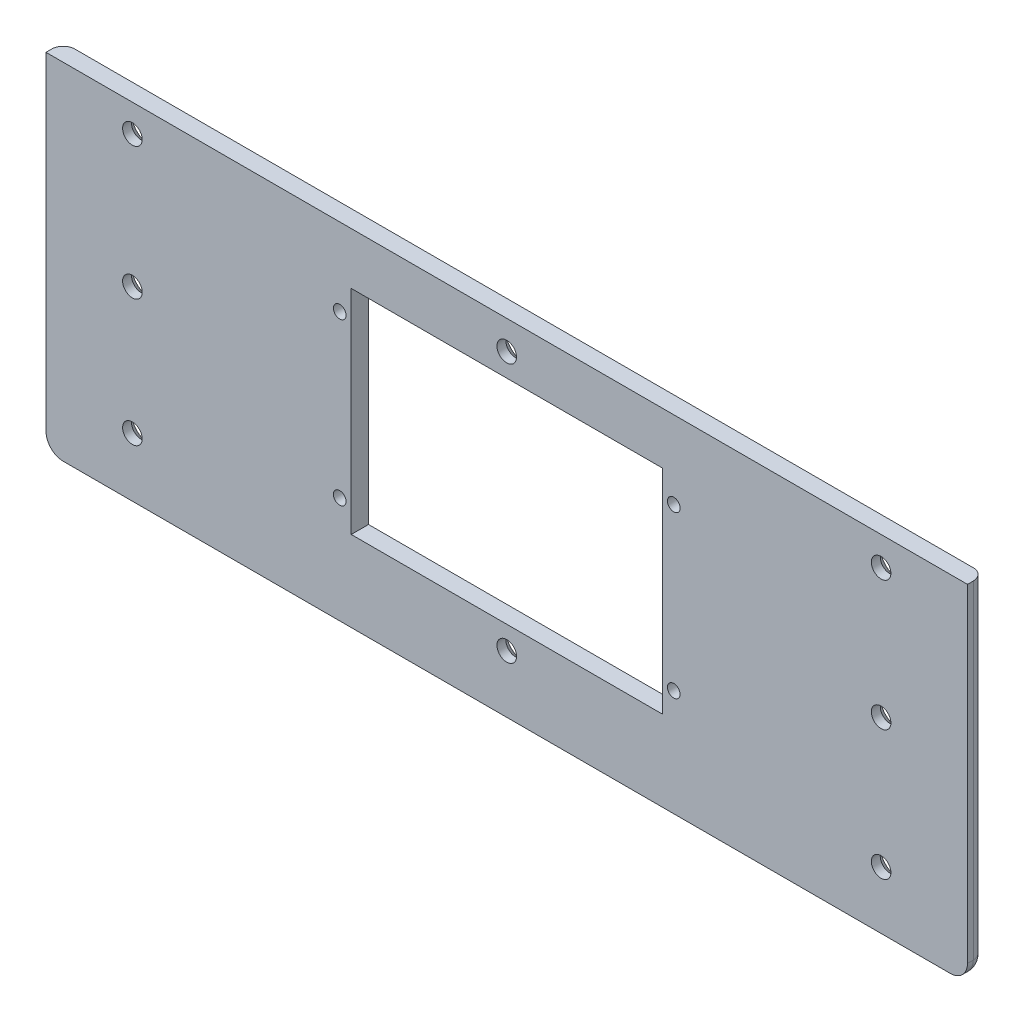
ISO-10303-21;
HEADER;
FILE_DESCRIPTION(('STEP AP214'),'2;1');
FILE_NAME('part.step','',(''),(''),'','','');
FILE_SCHEMA(('AUTOMOTIVE_DESIGN { 1 0 10303 214 1 1 1 1 }'));
ENDSEC;
DATA;
#1=APPLICATION_CONTEXT('core data for automotive mechanical design processes');
#2=APPLICATION_PROTOCOL_DEFINITION('international standard','automotive_design',2000,#1);
#3=PRODUCT_CONTEXT('',#1,'mechanical');
#4=PRODUCT('Part','Part','',(#3));
#5=PRODUCT_RELATED_PRODUCT_CATEGORY('part','',(#4));
#6=PRODUCT_DEFINITION_FORMATION('','',#4);
#7=PRODUCT_DEFINITION_CONTEXT('part definition',#1,'design');
#8=PRODUCT_DEFINITION('design','',#6,#7);
#9=PRODUCT_DEFINITION_SHAPE('','',#8);
#10=(LENGTH_UNIT() NAMED_UNIT(*) SI_UNIT(.MILLI.,.METRE.));
#11=(NAMED_UNIT(*) PLANE_ANGLE_UNIT() SI_UNIT($,.RADIAN.));
#12=(NAMED_UNIT(*) SI_UNIT($,.STERADIAN.) SOLID_ANGLE_UNIT());
#13=UNCERTAINTY_MEASURE_WITH_UNIT(LENGTH_MEASURE(1.E-05),#10,'distance_accuracy_value','');
#14=(GEOMETRIC_REPRESENTATION_CONTEXT(3) GLOBAL_UNCERTAINTY_ASSIGNED_CONTEXT((#13)) GLOBAL_UNIT_ASSIGNED_CONTEXT((#10,
#11,#12)) REPRESENTATION_CONTEXT('',''));
#15=CARTESIAN_POINT('',(0.,0.,0.));
#16=DIRECTION('',(0.,0.,1.));
#17=DIRECTION('',(1.,0.,0.));
#18=AXIS2_PLACEMENT_3D('',#15,#16,#17);
#19=CARTESIAN_POINT('',(0.,0.,0.));
#20=DIRECTION('',(0.,0.,-1.));
#21=DIRECTION('',(-1.,0.,0.));
#22=AXIS2_PLACEMENT_3D('',#19,#20,#21);
#23=PLANE('',#22);
#24=CARTESIAN_POINT('',(145.,54.9999999999999,0.));
#25=DIRECTION('',(0.,0.,-1.));
#26=DIRECTION('',(-1.,0.,0.));
#27=AXIS2_PLACEMENT_3D('',#24,#25,#26);
#28=CIRCLE('',#27,3.14999999999999);
#29=CARTESIAN_POINT('',(141.85,54.9999999999999,0.));
#30=VERTEX_POINT('',#29);
#31=EDGE_CURVE('E537',#30,#30,#28,.T.);
#32=ORIENTED_EDGE('',*,*,#31,.F.);
#33=EDGE_LOOP('',(#32));
#34=FACE_BOUND('',#33,.T.);
#35=CARTESIAN_POINT('',(145.,32.5,0.));
#36=DIRECTION('',(0.,0.,-1.));
#37=DIRECTION('',(-1.,0.,0.));
#38=AXIS2_PLACEMENT_3D('',#35,#36,#37);
#39=CIRCLE('',#38,3.15000000000001);
#40=CARTESIAN_POINT('',(141.85,32.5,0.));
#41=VERTEX_POINT('',#40);
#42=EDGE_CURVE('E547',#41,#41,#39,.T.);
#43=ORIENTED_EDGE('',*,*,#42,.F.);
#44=EDGE_LOOP('',(#43));
#45=FACE_BOUND('',#44,.T.);
#46=CARTESIAN_POINT('',(145.,9.99999999999992,0.));
#47=DIRECTION('',(0.,0.,-1.));
#48=DIRECTION('',(-1.,0.,0.));
#49=AXIS2_PLACEMENT_3D('',#46,#47,#48);
#50=CIRCLE('',#49,3.15000000000001);
#51=CARTESIAN_POINT('',(141.85,9.99999999999992,0.));
#52=VERTEX_POINT('',#51);
#53=EDGE_CURVE('E558',#52,#52,#50,.T.);
#54=ORIENTED_EDGE('',*,*,#53,.F.);
#55=EDGE_LOOP('',(#54));
#56=FACE_BOUND('',#55,.T.);
#57=CARTESIAN_POINT('',(80.,9.99999999999992,0.));
#58=DIRECTION('',(0.,0.,-1.));
#59=DIRECTION('',(-1.,0.,0.));
#60=AXIS2_PLACEMENT_3D('',#57,#58,#59);
#61=CIRCLE('',#60,3.15);
#62=CARTESIAN_POINT('',(76.85,9.99999999999992,0.));
#63=VERTEX_POINT('',#62);
#64=EDGE_CURVE('E570',#63,#63,#61,.T.);
#65=ORIENTED_EDGE('',*,*,#64,.F.);
#66=EDGE_LOOP('',(#65));
#67=FACE_BOUND('',#66,.T.);
#68=CARTESIAN_POINT('',(80.,54.9999999999999,0.));
#69=DIRECTION('',(0.,0.,-1.));
#70=DIRECTION('',(-1.,0.,0.));
#71=AXIS2_PLACEMENT_3D('',#68,#69,#70);
#72=CIRCLE('',#71,3.15);
#73=CARTESIAN_POINT('',(76.85,54.9999999999999,0.));
#74=VERTEX_POINT('',#73);
#75=EDGE_CURVE('E582',#74,#74,#72,.T.);
#76=ORIENTED_EDGE('',*,*,#75,.F.);
#77=EDGE_LOOP('',(#76));
#78=FACE_BOUND('',#77,.T.);
#79=CARTESIAN_POINT('',(14.9999999999998,55.2287243030791,0.));
#80=DIRECTION('',(0.,0.,-1.));
#81=DIRECTION('',(-1.,0.,0.));
#82=AXIS2_PLACEMENT_3D('',#79,#80,#81);
#83=CIRCLE('',#82,3.15);
#84=CARTESIAN_POINT('',(11.8499999999998,55.2287243030791,0.));
#85=VERTEX_POINT('',#84);
#86=EDGE_CURVE('E594',#85,#85,#83,.T.);
#87=ORIENTED_EDGE('',*,*,#86,.F.);
#88=EDGE_LOOP('',(#87));
#89=FACE_BOUND('',#88,.T.);
#90=CARTESIAN_POINT('',(14.9999999999998,32.2712756969208,0.));
#91=DIRECTION('',(0.,0.,-1.));
#92=DIRECTION('',(-1.,0.,0.));
#93=AXIS2_PLACEMENT_3D('',#90,#91,#92);
#94=CIRCLE('',#93,3.15);
#95=CARTESIAN_POINT('',(11.8499999999998,32.2712756969208,0.));
#96=VERTEX_POINT('',#95);
#97=EDGE_CURVE('E606',#96,#96,#94,.T.);
#98=ORIENTED_EDGE('',*,*,#97,.F.);
#99=EDGE_LOOP('',(#98));
#100=FACE_BOUND('',#99,.T.);
#101=CARTESIAN_POINT('',(14.9999999999998,10.2287243030791,0.));
#102=DIRECTION('',(0.,0.,-1.));
#103=DIRECTION('',(-1.,0.,0.));
#104=AXIS2_PLACEMENT_3D('',#101,#102,#103);
#105=CIRCLE('',#104,3.15);
#106=CARTESIAN_POINT('',(11.8499999999998,10.2287243030791,0.));
#107=VERTEX_POINT('',#106);
#108=EDGE_CURVE('E330',#107,#107,#105,.T.);
#109=ORIENTED_EDGE('',*,*,#108,.F.);
#110=EDGE_LOOP('',(#109));
#111=FACE_BOUND('',#110,.T.);
#112=CARTESIAN_POINT('',(50.9999999999999,46.4999999999999,0.));
#113=DIRECTION('',(0.,0.,-1.));
#114=DIRECTION('',(-1.,0.,0.));
#115=AXIS2_PLACEMENT_3D('',#112,#113,#114);
#116=CIRCLE('',#115,1.1);
#117=CARTESIAN_POINT('',(49.8999999999999,46.4999999999999,0.));
#118=VERTEX_POINT('',#117);
#119=EDGE_CURVE('E315',#118,#118,#116,.T.);
#120=ORIENTED_EDGE('',*,*,#119,.F.);
#121=EDGE_LOOP('',(#120));
#122=FACE_BOUND('',#121,.T.);
#123=CARTESIAN_POINT('',(50.9999999999999,18.5,0.));
#124=DIRECTION('',(0.,0.,-1.));
#125=DIRECTION('',(-1.,0.,0.));
#126=AXIS2_PLACEMENT_3D('',#123,#124,#125);
#127=CIRCLE('',#126,1.1);
#128=CARTESIAN_POINT('',(49.8999999999999,18.5,0.));
#129=VERTEX_POINT('',#128);
#130=EDGE_CURVE('E348',#129,#129,#127,.T.);
#131=ORIENTED_EDGE('',*,*,#130,.F.);
#132=EDGE_LOOP('',(#131));
#133=FACE_BOUND('',#132,.T.);
#134=CARTESIAN_POINT('',(109.,18.5,0.));
#135=DIRECTION('',(0.,0.,-1.));
#136=DIRECTION('',(-1.,0.,0.));
#137=AXIS2_PLACEMENT_3D('',#134,#135,#136);
#138=CIRCLE('',#137,1.10000000000001);
#139=CARTESIAN_POINT('',(107.9,18.5,0.));
#140=VERTEX_POINT('',#139);
#141=EDGE_CURVE('E341',#140,#140,#138,.T.);
#142=ORIENTED_EDGE('',*,*,#141,.F.);
#143=EDGE_LOOP('',(#142));
#144=FACE_BOUND('',#143,.T.);
#145=CARTESIAN_POINT('',(109.,46.5,0.));
#146=DIRECTION('',(0.,0.,-1.));
#147=DIRECTION('',(-1.,0.,0.));
#148=AXIS2_PLACEMENT_3D('',#145,#146,#147);
#149=CIRCLE('',#148,1.10000000000001);
#150=CARTESIAN_POINT('',(107.9,46.5,0.));
#151=VERTEX_POINT('',#150);
#152=EDGE_CURVE('E213',#151,#151,#149,.T.);
#153=ORIENTED_EDGE('',*,*,#152,.F.);
#154=EDGE_LOOP('',(#153));
#155=FACE_BOUND('',#154,.T.);
#156=DIRECTION('',(0.,-1.,0.));
#157=VECTOR('',#156,1.);
#158=CARTESIAN_POINT('',(107.,50.9999999999999,0.));
#159=LINE('',#158,#157);
#160=CARTESIAN_POINT('',(107.,50.9999999999999,0.));
#161=VERTEX_POINT('',#160);
#162=CARTESIAN_POINT('',(107.,14.,0.));
#163=VERTEX_POINT('',#162);
#164=EDGE_CURVE('E174',#161,#163,#159,.T.);
#165=ORIENTED_EDGE('',*,*,#164,.F.);
#166=DIRECTION('',(1.,0.,0.));
#167=VECTOR('',#166,1.);
#168=CARTESIAN_POINT('',(107.,50.9999999999999,0.));
#169=LINE('',#168,#167);
#170=CARTESIAN_POINT('',(52.9999999999999,50.9999999999999,0.));
#171=VERTEX_POINT('',#170);
#172=EDGE_CURVE('E194',#171,#161,#169,.T.);
#173=ORIENTED_EDGE('',*,*,#172,.F.);
#174=DIRECTION('',(0.,1.,0.));
#175=VECTOR('',#174,1.);
#176=CARTESIAN_POINT('',(52.9999999999999,50.9999999999999,0.));
#177=LINE('',#176,#175);
#178=CARTESIAN_POINT('',(52.9999999999999,14.,0.));
#179=VERTEX_POINT('',#178);
#180=EDGE_CURVE('E200',#179,#171,#177,.T.);
#181=ORIENTED_EDGE('',*,*,#180,.F.);
#182=DIRECTION('',(-1.,0.,0.));
#183=VECTOR('',#182,1.);
#184=CARTESIAN_POINT('',(107.,14.,0.));
#185=LINE('',#184,#183);
#186=EDGE_CURVE('E212',#163,#179,#185,.T.);
#187=ORIENTED_EDGE('',*,*,#186,.F.);
#188=EDGE_LOOP('',(#165,#173,#181,#187));
#189=FACE_BOUND('',#188,.T.);
#190=CARTESIAN_POINT('',(157.,3.,0.));
#191=DIRECTION('',(0.,0.,-1.));
#192=DIRECTION('',(-1.,0.,0.));
#193=AXIS2_PLACEMENT_3D('',#190,#191,#192);
#194=CIRCLE('',#193,1.);
#195=CARTESIAN_POINT('',(157.,2.,0.));
#196=VERTEX_POINT('',#195);
#197=CARTESIAN_POINT('',(158.,3.,0.));
#198=VERTEX_POINT('',#197);
#199=EDGE_CURVE('E286',#196,#198,#194,.F.);
#200=ORIENTED_EDGE('',*,*,#199,.F.);
#201=DIRECTION('',(1.,0.,0.));
#202=VECTOR('',#201,1.);
#203=CARTESIAN_POINT('',(0.,2.,0.));
#204=LINE('',#203,#202);
#205=CARTESIAN_POINT('',(3.,2.,0.));
#206=VERTEX_POINT('',#205);
#207=EDGE_CURVE('E259',#196,#206,#204,.F.);
#208=ORIENTED_EDGE('',*,*,#207,.T.);
#209=CARTESIAN_POINT('',(3.,3.,0.));
#210=DIRECTION('',(0.,0.,-1.));
#211=DIRECTION('',(-1.,0.,0.));
#212=AXIS2_PLACEMENT_3D('',#209,#210,#211);
#213=CIRCLE('',#212,1.);
#214=CARTESIAN_POINT('',(2.,3.,0.));
#215=VERTEX_POINT('',#214);
#216=EDGE_CURVE('E282',#215,#206,#213,.F.);
#217=ORIENTED_EDGE('',*,*,#216,.F.);
#218=DIRECTION('',(0.,-1.,0.));
#219=VECTOR('',#218,1.);
#220=CARTESIAN_POINT('',(2.,60.,0.));
#221=LINE('',#220,#219);
#222=CARTESIAN_POINT('',(2.,60.,0.));
#223=VERTEX_POINT('',#222);
#224=EDGE_CURVE('E263',#215,#223,#221,.F.);
#225=ORIENTED_EDGE('',*,*,#224,.T.);
#226=DIRECTION('',(-1.,0.,0.));
#227=VECTOR('',#226,1.);
#228=CARTESIAN_POINT('',(0.,60.,0.));
#229=LINE('',#228,#227);
#230=CARTESIAN_POINT('',(158.,60.,0.));
#231=VERTEX_POINT('',#230);
#232=EDGE_CURVE('E222',#231,#223,#229,.T.);
#233=ORIENTED_EDGE('',*,*,#232,.F.);
#234=DIRECTION('',(0.,1.,0.));
#235=VECTOR('',#234,1.);
#236=CARTESIAN_POINT('',(158.,0.,0.));
#237=LINE('',#236,#235);
#238=EDGE_CURVE('E255',#231,#198,#237,.F.);
#239=ORIENTED_EDGE('',*,*,#238,.T.);
#240=EDGE_LOOP('',(#200,#208,#217,#225,#233,#239));
#241=FACE_BOUND('',#240,.T.);
#242=ADVANCED_FACE('F47',(#34,#45,#56,#67,#78,#89,#100,#111,#122,#133,#144,#155,#189,#241),#23,.T.);
#243=CARTESIAN_POINT('',(0.,0.,3.));
#244=DIRECTION('',(1.,0.,0.));
#245=DIRECTION('',(0.,0.,-1.));
#246=AXIS2_PLACEMENT_3D('',#243,#244,#245);
#247=PLANE('',#246);
#248=DIRECTION('',(0.,-1.,0.));
#249=VECTOR('',#248,1.);
#250=CARTESIAN_POINT('',(0.,0.,2.));
#251=LINE('',#250,#249);
#252=CARTESIAN_POINT('',(0.,60.,2.));
#253=VERTEX_POINT('',#252);
#254=CARTESIAN_POINT('',(0.,3.,2.));
#255=VERTEX_POINT('',#254);
#256=EDGE_CURVE('E266',#253,#255,#251,.T.);
#257=ORIENTED_EDGE('',*,*,#256,.T.);
#258=DIRECTION('',(0.,0.,-1.));
#259=VECTOR('',#258,1.);
#260=CARTESIAN_POINT('',(0.,3.,3.));
#261=LINE('',#260,#259);
#262=CARTESIAN_POINT('',(0.,3.,3.));
#263=VERTEX_POINT('',#262);
#264=EDGE_CURVE('E75',#255,#263,#261,.F.);
#265=ORIENTED_EDGE('',*,*,#264,.T.);
#266=DIRECTION('',(0.,-1.,0.));
#267=VECTOR('',#266,1.);
#268=CARTESIAN_POINT('',(0.,0.,3.));
#269=LINE('',#268,#267);
#270=CARTESIAN_POINT('',(0.,60.,3.));
#271=VERTEX_POINT('',#270);
#272=EDGE_CURVE('E228',#271,#263,#269,.T.);
#273=ORIENTED_EDGE('',*,*,#272,.F.);
#274=DIRECTION('',(0.,0.,-1.));
#275=VECTOR('',#274,1.);
#276=CARTESIAN_POINT('',(0.,60.,3.));
#277=LINE('',#276,#275);
#278=EDGE_CURVE('E240',#271,#253,#277,.T.);
#279=ORIENTED_EDGE('',*,*,#278,.T.);
#280=EDGE_LOOP('',(#257,#265,#273,#279));
#281=FACE_BOUND('',#280,.T.);
#282=ADVANCED_FACE('F363',(#281),#247,.F.);
#283=CARTESIAN_POINT('',(0.,0.,3.));
#284=DIRECTION('',(0.,1.,0.));
#285=DIRECTION('',(0.,0.,1.));
#286=AXIS2_PLACEMENT_3D('',#283,#284,#285);
#287=PLANE('',#286);
#288=DIRECTION('',(1.,0.,0.));
#289=VECTOR('',#288,1.);
#290=CARTESIAN_POINT('',(0.,0.,3.));
#291=LINE('',#290,#289);
#292=CARTESIAN_POINT('',(3.,0.,3.));
#293=VERTEX_POINT('',#292);
#294=CARTESIAN_POINT('',(157.,0.,3.));
#295=VERTEX_POINT('',#294);
#296=EDGE_CURVE('E231',#293,#295,#291,.T.);
#297=ORIENTED_EDGE('',*,*,#296,.F.);
#298=DIRECTION('',(0.,0.,-1.));
#299=VECTOR('',#298,1.);
#300=CARTESIAN_POINT('',(3.,0.,3.));
#301=LINE('',#300,#299);
#302=CARTESIAN_POINT('',(3.,0.,2.));
#303=VERTEX_POINT('',#302);
#304=EDGE_CURVE('E300',#293,#303,#301,.T.);
#305=ORIENTED_EDGE('',*,*,#304,.T.);
#306=DIRECTION('',(1.,0.,0.));
#307=VECTOR('',#306,1.);
#308=CARTESIAN_POINT('',(160.,0.,2.));
#309=LINE('',#308,#307);
#310=CARTESIAN_POINT('',(157.,0.,2.));
#311=VERTEX_POINT('',#310);
#312=EDGE_CURVE('E251',#303,#311,#309,.T.);
#313=ORIENTED_EDGE('',*,*,#312,.T.);
#314=DIRECTION('',(0.,0.,-1.));
#315=VECTOR('',#314,1.);
#316=CARTESIAN_POINT('',(157.,0.,3.));
#317=LINE('',#316,#315);
#318=EDGE_CURVE('E298',#311,#295,#317,.F.);
#319=ORIENTED_EDGE('',*,*,#318,.T.);
#320=EDGE_LOOP('',(#297,#305,#313,#319));
#321=FACE_BOUND('',#320,.T.);
#322=ADVANCED_FACE('F416',(#321),#287,.F.);
#323=CARTESIAN_POINT('',(160.,0.,3.));
#324=DIRECTION('',(-1.,0.,0.));
#325=DIRECTION('',(0.,0.,1.));
#326=AXIS2_PLACEMENT_3D('',#323,#324,#325);
#327=PLANE('',#326);
#328=DIRECTION('',(0.,1.,0.));
#329=VECTOR('',#328,1.);
#330=CARTESIAN_POINT('',(160.,0.,3.));
#331=LINE('',#330,#329);
#332=CARTESIAN_POINT('',(160.,3.,3.));
#333=VERTEX_POINT('',#332);
#334=CARTESIAN_POINT('',(160.,60.,3.));
#335=VERTEX_POINT('',#334);
#336=EDGE_CURVE('E234',#333,#335,#331,.T.);
#337=ORIENTED_EDGE('',*,*,#336,.F.);
#338=DIRECTION('',(0.,0.,-1.));
#339=VECTOR('',#338,1.);
#340=CARTESIAN_POINT('',(160.,3.,3.));
#341=LINE('',#340,#339);
#342=CARTESIAN_POINT('',(160.,3.,2.));
#343=VERTEX_POINT('',#342);
#344=EDGE_CURVE('E11',#333,#343,#341,.T.);
#345=ORIENTED_EDGE('',*,*,#344,.T.);
#346=DIRECTION('',(0.,1.,0.));
#347=VECTOR('',#346,1.);
#348=CARTESIAN_POINT('',(160.,60.,2.));
#349=LINE('',#348,#347);
#350=CARTESIAN_POINT('',(160.,60.,2.));
#351=VERTEX_POINT('',#350);
#352=EDGE_CURVE('E275',#343,#351,#349,.T.);
#353=ORIENTED_EDGE('',*,*,#352,.T.);
#354=DIRECTION('',(0.,0.,-1.));
#355=VECTOR('',#354,1.);
#356=CARTESIAN_POINT('',(160.,60.,3.));
#357=LINE('',#356,#355);
#358=EDGE_CURVE('E247',#335,#351,#357,.T.);
#359=ORIENTED_EDGE('',*,*,#358,.F.);
#360=EDGE_LOOP('',(#337,#345,#353,#359));
#361=FACE_BOUND('',#360,.T.);
#362=ADVANCED_FACE('F421',(#361),#327,.F.);
#363=CARTESIAN_POINT('',(0.,60.,3.));
#364=DIRECTION('',(0.,-1.,0.));
#365=DIRECTION('',(0.,0.,-1.));
#366=AXIS2_PLACEMENT_3D('',#363,#364,#365);
#367=PLANE('',#366);
#368=ORIENTED_EDGE('',*,*,#232,.T.);
#369=CARTESIAN_POINT('',(2.,60.,2.));
#370=DIRECTION('',(0.,-1.,0.));
#371=DIRECTION('',(0.,0.,-1.));
#372=AXIS2_PLACEMENT_3D('',#369,#370,#371);
#373=CIRCLE('',#372,2.);
#374=EDGE_CURVE('E272',#223,#253,#373,.F.);
#375=ORIENTED_EDGE('',*,*,#374,.T.);
#376=ORIENTED_EDGE('',*,*,#278,.F.);
#377=DIRECTION('',(-1.,0.,0.));
#378=VECTOR('',#377,1.);
#379=CARTESIAN_POINT('',(0.,60.,3.));
#380=LINE('',#379,#378);
#381=EDGE_CURVE('E237',#335,#271,#380,.T.);
#382=ORIENTED_EDGE('',*,*,#381,.F.);
#383=ORIENTED_EDGE('',*,*,#358,.T.);
#384=CARTESIAN_POINT('',(158.,60.,2.));
#385=DIRECTION('',(0.,-1.,0.));
#386=DIRECTION('',(0.,0.,-1.));
#387=AXIS2_PLACEMENT_3D('',#384,#385,#386);
#388=CIRCLE('',#387,2.);
#389=EDGE_CURVE('E269',#351,#231,#388,.F.);
#390=ORIENTED_EDGE('',*,*,#389,.T.);
#391=EDGE_LOOP('',(#368,#375,#376,#382,#383,#390));
#392=FACE_BOUND('',#391,.T.);
#393=ADVANCED_FACE('F410',(#392),#367,.F.);
#394=CARTESIAN_POINT('',(0.,0.,3.));
#395=DIRECTION('',(0.,0.,-1.));
#396=DIRECTION('',(-1.,0.,0.));
#397=AXIS2_PLACEMENT_3D('',#394,#395,#396);
#398=PLANE('',#397);
#399=CARTESIAN_POINT('',(145.,54.9999999999999,3.));
#400=DIRECTION('',(0.,0.,-1.));
#401=DIRECTION('',(-1.,0.,0.));
#402=AXIS2_PLACEMENT_3D('',#399,#400,#401);
#403=CIRCLE('',#402,1.70000000000001);
#404=CARTESIAN_POINT('',(143.3,54.9999999999999,3.));
#405=VERTEX_POINT('',#404);
#406=EDGE_CURVE('E541',#405,#405,#403,.T.);
#407=ORIENTED_EDGE('',*,*,#406,.T.);
#408=EDGE_LOOP('',(#407));
#409=FACE_BOUND('',#408,.T.);
#410=CARTESIAN_POINT('',(145.,32.5,3.));
#411=DIRECTION('',(0.,0.,-1.));
#412=DIRECTION('',(-1.,0.,0.));
#413=AXIS2_PLACEMENT_3D('',#410,#411,#412);
#414=CIRCLE('',#413,1.70000000000001);
#415=CARTESIAN_POINT('',(143.3,32.5,3.));
#416=VERTEX_POINT('',#415);
#417=EDGE_CURVE('E554',#416,#416,#414,.T.);
#418=ORIENTED_EDGE('',*,*,#417,.T.);
#419=EDGE_LOOP('',(#418));
#420=FACE_BOUND('',#419,.T.);
#421=CARTESIAN_POINT('',(145.,9.99999999999992,3.));
#422=DIRECTION('',(0.,0.,-1.));
#423=DIRECTION('',(-1.,0.,0.));
#424=AXIS2_PLACEMENT_3D('',#421,#422,#423);
#425=CIRCLE('',#424,1.70000000000001);
#426=CARTESIAN_POINT('',(143.3,9.99999999999992,3.));
#427=VERTEX_POINT('',#426);
#428=EDGE_CURVE('E566',#427,#427,#425,.T.);
#429=ORIENTED_EDGE('',*,*,#428,.T.);
#430=EDGE_LOOP('',(#429));
#431=FACE_BOUND('',#430,.T.);
#432=CARTESIAN_POINT('',(80.,9.99999999999992,3.));
#433=DIRECTION('',(0.,0.,-1.));
#434=DIRECTION('',(-1.,0.,0.));
#435=AXIS2_PLACEMENT_3D('',#432,#433,#434);
#436=CIRCLE('',#435,1.69999999999999);
#437=CARTESIAN_POINT('',(78.3,9.99999999999992,3.));
#438=VERTEX_POINT('',#437);
#439=EDGE_CURVE('E578',#438,#438,#436,.T.);
#440=ORIENTED_EDGE('',*,*,#439,.T.);
#441=EDGE_LOOP('',(#440));
#442=FACE_BOUND('',#441,.T.);
#443=CARTESIAN_POINT('',(80.,54.9999999999999,3.));
#444=DIRECTION('',(0.,0.,-1.));
#445=DIRECTION('',(-1.,0.,0.));
#446=AXIS2_PLACEMENT_3D('',#443,#444,#445);
#447=CIRCLE('',#446,1.69999999999999);
#448=CARTESIAN_POINT('',(78.3,54.9999999999999,3.));
#449=VERTEX_POINT('',#448);
#450=EDGE_CURVE('E590',#449,#449,#447,.T.);
#451=ORIENTED_EDGE('',*,*,#450,.T.);
#452=EDGE_LOOP('',(#451));
#453=FACE_BOUND('',#452,.T.);
#454=CARTESIAN_POINT('',(14.9999999999998,55.2287243030791,3.));
#455=DIRECTION('',(0.,0.,-1.));
#456=DIRECTION('',(-1.,0.,0.));
#457=AXIS2_PLACEMENT_3D('',#454,#455,#456);
#458=CIRCLE('',#457,1.7);
#459=CARTESIAN_POINT('',(13.2999999999998,55.2287243030791,3.));
#460=VERTEX_POINT('',#459);
#461=EDGE_CURVE('E602',#460,#460,#458,.T.);
#462=ORIENTED_EDGE('',*,*,#461,.T.);
#463=EDGE_LOOP('',(#462));
#464=FACE_BOUND('',#463,.T.);
#465=CARTESIAN_POINT('',(14.9999999999998,32.2712756969208,3.));
#466=DIRECTION('',(0.,0.,-1.));
#467=DIRECTION('',(-1.,0.,0.));
#468=AXIS2_PLACEMENT_3D('',#465,#466,#467);
#469=CIRCLE('',#468,1.7);
#470=CARTESIAN_POINT('',(13.2999999999998,32.2712756969208,3.));
#471=VERTEX_POINT('',#470);
#472=EDGE_CURVE('E614',#471,#471,#469,.T.);
#473=ORIENTED_EDGE('',*,*,#472,.T.);
#474=EDGE_LOOP('',(#473));
#475=FACE_BOUND('',#474,.T.);
#476=CARTESIAN_POINT('',(14.9999999999998,10.2287243030791,3.));
#477=DIRECTION('',(0.,0.,-1.));
#478=DIRECTION('',(-1.,0.,0.));
#479=AXIS2_PLACEMENT_3D('',#476,#477,#478);
#480=CIRCLE('',#479,1.7);
#481=CARTESIAN_POINT('',(13.2999999999998,10.2287243030791,3.));
#482=VERTEX_POINT('',#481);
#483=EDGE_CURVE('E318',#482,#482,#480,.T.);
#484=ORIENTED_EDGE('',*,*,#483,.T.);
#485=EDGE_LOOP('',(#484));
#486=FACE_BOUND('',#485,.T.);
#487=CARTESIAN_POINT('',(50.9999999999999,46.4999999999999,3.));
#488=DIRECTION('',(0.,0.,-1.));
#489=DIRECTION('',(-1.,0.,0.));
#490=AXIS2_PLACEMENT_3D('',#487,#488,#489);
#491=CIRCLE('',#490,1.1);
#492=CARTESIAN_POINT('',(49.8999999999999,46.4999999999999,3.));
#493=VERTEX_POINT('',#492);
#494=EDGE_CURVE('E203',#493,#493,#491,.T.);
#495=ORIENTED_EDGE('',*,*,#494,.T.);
#496=EDGE_LOOP('',(#495));
#497=FACE_BOUND('',#496,.T.);
#498=CARTESIAN_POINT('',(50.9999999999999,18.5,3.));
#499=DIRECTION('',(0.,0.,-1.));
#500=DIRECTION('',(-1.,0.,0.));
#501=AXIS2_PLACEMENT_3D('',#498,#499,#500);
#502=CIRCLE('',#501,1.1);
#503=CARTESIAN_POINT('',(49.8999999999999,18.5,3.));
#504=VERTEX_POINT('',#503);
#505=EDGE_CURVE('E352',#504,#504,#502,.T.);
#506=ORIENTED_EDGE('',*,*,#505,.T.);
#507=EDGE_LOOP('',(#506));
#508=FACE_BOUND('',#507,.T.);
#509=CARTESIAN_POINT('',(109.,18.5,3.));
#510=DIRECTION('',(0.,0.,-1.));
#511=DIRECTION('',(-1.,0.,0.));
#512=AXIS2_PLACEMENT_3D('',#509,#510,#511);
#513=CIRCLE('',#512,1.10000000000001);
#514=CARTESIAN_POINT('',(107.9,18.5,3.));
#515=VERTEX_POINT('',#514);
#516=EDGE_CURVE('E345',#515,#515,#513,.T.);
#517=ORIENTED_EDGE('',*,*,#516,.T.);
#518=EDGE_LOOP('',(#517));
#519=FACE_BOUND('',#518,.T.);
#520=CARTESIAN_POINT('',(109.,46.5,3.));
#521=DIRECTION('',(0.,0.,-1.));
#522=DIRECTION('',(-1.,0.,0.));
#523=AXIS2_PLACEMENT_3D('',#520,#521,#522);
#524=CIRCLE('',#523,1.10000000000001);
#525=CARTESIAN_POINT('',(107.9,46.5,3.));
#526=VERTEX_POINT('',#525);
#527=EDGE_CURVE('E337',#526,#526,#524,.T.);
#528=ORIENTED_EDGE('',*,*,#527,.T.);
#529=EDGE_LOOP('',(#528));
#530=FACE_BOUND('',#529,.T.);
#531=DIRECTION('',(1.,0.,0.));
#532=VECTOR('',#531,1.);
#533=CARTESIAN_POINT('',(107.,50.9999999999999,3.));
#534=LINE('',#533,#532);
#535=CARTESIAN_POINT('',(52.9999999999999,50.9999999999999,3.));
#536=VERTEX_POINT('',#535);
#537=CARTESIAN_POINT('',(107.,50.9999999999999,3.));
#538=VERTEX_POINT('',#537);
#539=EDGE_CURVE('E180',#536,#538,#534,.T.);
#540=ORIENTED_EDGE('',*,*,#539,.T.);
#541=DIRECTION('',(0.,-1.,0.));
#542=VECTOR('',#541,1.);
#543=CARTESIAN_POINT('',(107.,50.9999999999999,3.));
#544=LINE('',#543,#542);
#545=CARTESIAN_POINT('',(107.,14.,3.));
#546=VERTEX_POINT('',#545);
#547=EDGE_CURVE('E171',#538,#546,#544,.T.);
#548=ORIENTED_EDGE('',*,*,#547,.T.);
#549=DIRECTION('',(-1.,0.,0.));
#550=VECTOR('',#549,1.);
#551=CARTESIAN_POINT('',(107.,14.,3.));
#552=LINE('',#551,#550);
#553=CARTESIAN_POINT('',(52.9999999999999,14.,3.));
#554=VERTEX_POINT('',#553);
#555=EDGE_CURVE('E184',#546,#554,#552,.T.);
#556=ORIENTED_EDGE('',*,*,#555,.T.);
#557=DIRECTION('',(0.,1.,0.));
#558=VECTOR('',#557,1.);
#559=CARTESIAN_POINT('',(52.9999999999999,50.9999999999999,3.));
#560=LINE('',#559,#558);
#561=EDGE_CURVE('E189',#554,#536,#560,.T.);
#562=ORIENTED_EDGE('',*,*,#561,.T.);
#563=EDGE_LOOP('',(#540,#548,#556,#562));
#564=FACE_BOUND('',#563,.T.);
#565=ORIENTED_EDGE('',*,*,#272,.T.);
#566=CARTESIAN_POINT('',(3.,3.,3.));
#567=DIRECTION('',(0.,0.,-1.));
#568=DIRECTION('',(-1.,0.,0.));
#569=AXIS2_PLACEMENT_3D('',#566,#567,#568);
#570=CIRCLE('',#569,3.);
#571=EDGE_CURVE('E56',#263,#293,#570,.F.);
#572=ORIENTED_EDGE('',*,*,#571,.T.);
#573=ORIENTED_EDGE('',*,*,#296,.T.);
#574=CARTESIAN_POINT('',(157.,3.,3.));
#575=DIRECTION('',(0.,0.,-1.));
#576=DIRECTION('',(-1.,0.,0.));
#577=AXIS2_PLACEMENT_3D('',#574,#575,#576);
#578=CIRCLE('',#577,3.);
#579=EDGE_CURVE('E64',#295,#333,#578,.F.);
#580=ORIENTED_EDGE('',*,*,#579,.T.);
#581=ORIENTED_EDGE('',*,*,#336,.T.);
#582=ORIENTED_EDGE('',*,*,#381,.T.);
#583=EDGE_LOOP('',(#565,#572,#573,#580,#581,#582));
#584=FACE_BOUND('',#583,.T.);
#585=ADVANCED_FACE('F191',(#409,#420,#431,#442,#453,#464,#475,#486,#497,#508,#519,#530,#564,
#584),#398,.F.);
#586=CARTESIAN_POINT('',(107.,50.9999999999999,3.));
#587=DIRECTION('',(1.,0.,0.));
#588=DIRECTION('',(0.,0.,-1.));
#589=AXIS2_PLACEMENT_3D('',#586,#587,#588);
#590=PLANE('',#589);
#591=ORIENTED_EDGE('',*,*,#164,.T.);
#592=DIRECTION('',(0.,0.,-1.));
#593=VECTOR('',#592,1.);
#594=CARTESIAN_POINT('',(107.,14.,3.));
#595=LINE('',#594,#593);
#596=EDGE_CURVE('E167',#546,#163,#595,.T.);
#597=ORIENTED_EDGE('',*,*,#596,.F.);
#598=ORIENTED_EDGE('',*,*,#547,.F.);
#599=DIRECTION('',(0.,0.,-1.));
#600=VECTOR('',#599,1.);
#601=CARTESIAN_POINT('',(107.,50.9999999999999,3.));
#602=LINE('',#601,#600);
#603=EDGE_CURVE('E219',#538,#161,#602,.T.);
#604=ORIENTED_EDGE('',*,*,#603,.T.);
#605=EDGE_LOOP('',(#591,#597,#598,#604));
#606=FACE_BOUND('',#605,.T.);
#607=ADVANCED_FACE('F169',(#606),#590,.F.);
#608=CARTESIAN_POINT('',(107.,50.9999999999999,3.));
#609=DIRECTION('',(0.,1.,0.));
#610=DIRECTION('',(0.,0.,1.));
#611=AXIS2_PLACEMENT_3D('',#608,#609,#610);
#612=PLANE('',#611);
#613=ORIENTED_EDGE('',*,*,#172,.T.);
#614=ORIENTED_EDGE('',*,*,#603,.F.);
#615=ORIENTED_EDGE('',*,*,#539,.F.);
#616=DIRECTION('',(0.,0.,-1.));
#617=VECTOR('',#616,1.);
#618=CARTESIAN_POINT('',(52.9999999999999,50.9999999999999,3.));
#619=LINE('',#618,#617);
#620=EDGE_CURVE('E223',#536,#171,#619,.T.);
#621=ORIENTED_EDGE('',*,*,#620,.T.);
#622=EDGE_LOOP('',(#613,#614,#615,#621));
#623=FACE_BOUND('',#622,.T.);
#624=ADVANCED_FACE('F446',(#623),#612,.F.);
#625=CARTESIAN_POINT('',(52.9999999999999,50.9999999999999,3.));
#626=DIRECTION('',(-1.,0.,0.));
#627=DIRECTION('',(0.,-1.,0.));
#628=AXIS2_PLACEMENT_3D('',#625,#626,#627);
#629=PLANE('',#628);
#630=ORIENTED_EDGE('',*,*,#180,.T.);
#631=ORIENTED_EDGE('',*,*,#620,.F.);
#632=ORIENTED_EDGE('',*,*,#561,.F.);
#633=DIRECTION('',(0.,0.,-1.));
#634=VECTOR('',#633,1.);
#635=CARTESIAN_POINT('',(52.9999999999999,14.,3.));
#636=LINE('',#635,#634);
#637=EDGE_CURVE('E179',#554,#179,#636,.T.);
#638=ORIENTED_EDGE('',*,*,#637,.T.);
#639=EDGE_LOOP('',(#630,#631,#632,#638));
#640=FACE_BOUND('',#639,.T.);
#641=ADVANCED_FACE('F450',(#640),#629,.F.);
#642=CARTESIAN_POINT('',(107.,14.,3.));
#643=DIRECTION('',(0.,-1.,0.));
#644=DIRECTION('',(0.,0.,-1.));
#645=AXIS2_PLACEMENT_3D('',#642,#643,#644);
#646=PLANE('',#645);
#647=ORIENTED_EDGE('',*,*,#186,.T.);
#648=ORIENTED_EDGE('',*,*,#637,.F.);
#649=ORIENTED_EDGE('',*,*,#555,.F.);
#650=ORIENTED_EDGE('',*,*,#596,.T.);
#651=EDGE_LOOP('',(#647,#648,#649,#650));
#652=FACE_BOUND('',#651,.T.);
#653=ADVANCED_FACE('F185',(#652),#646,.F.);
#654=CARTESIAN_POINT('',(109.,46.5,3.));
#655=DIRECTION('',(0.,0.,-1.));
#656=DIRECTION('',(-1.,0.,0.));
#657=AXIS2_PLACEMENT_3D('',#654,#655,#656);
#658=CYLINDRICAL_SURFACE('',#657,1.10000000000001);
#659=ORIENTED_EDGE('',*,*,#527,.F.);
#660=EDGE_LOOP('',(#659));
#661=FACE_BOUND('',#660,.T.);
#662=ORIENTED_EDGE('',*,*,#152,.T.);
#663=EDGE_LOOP('',(#662));
#664=FACE_BOUND('',#663,.T.);
#665=ADVANCED_FACE('F449',(#661,#664),#658,.F.);
#666=CARTESIAN_POINT('',(109.,18.5,3.));
#667=DIRECTION('',(0.,0.,-1.));
#668=DIRECTION('',(-1.,0.,0.));
#669=AXIS2_PLACEMENT_3D('',#666,#667,#668);
#670=CYLINDRICAL_SURFACE('',#669,1.10000000000001);
#671=ORIENTED_EDGE('',*,*,#516,.F.);
#672=EDGE_LOOP('',(#671));
#673=FACE_BOUND('',#672,.T.);
#674=ORIENTED_EDGE('',*,*,#141,.T.);
#675=EDGE_LOOP('',(#674));
#676=FACE_BOUND('',#675,.T.);
#677=ADVANCED_FACE('F463',(#673,#676),#670,.F.);
#678=CARTESIAN_POINT('',(50.9999999999999,18.5,3.));
#679=DIRECTION('',(0.,0.,-1.));
#680=DIRECTION('',(-1.,0.,0.));
#681=AXIS2_PLACEMENT_3D('',#678,#679,#680);
#682=CYLINDRICAL_SURFACE('',#681,1.1);
#683=ORIENTED_EDGE('',*,*,#505,.F.);
#684=EDGE_LOOP('',(#683));
#685=FACE_BOUND('',#684,.T.);
#686=ORIENTED_EDGE('',*,*,#130,.T.);
#687=EDGE_LOOP('',(#686));
#688=FACE_BOUND('',#687,.T.);
#689=ADVANCED_FACE('F459',(#685,#688),#682,.F.);
#690=CARTESIAN_POINT('',(50.9999999999999,46.4999999999999,3.));
#691=DIRECTION('',(0.,0.,-1.));
#692=DIRECTION('',(-1.,0.,0.));
#693=AXIS2_PLACEMENT_3D('',#690,#691,#692);
#694=CYLINDRICAL_SURFACE('',#693,1.1);
#695=ORIENTED_EDGE('',*,*,#494,.F.);
#696=EDGE_LOOP('',(#695));
#697=FACE_BOUND('',#696,.T.);
#698=ORIENTED_EDGE('',*,*,#119,.T.);
#699=EDGE_LOOP('',(#698));
#700=FACE_BOUND('',#699,.T.);
#701=ADVANCED_FACE('F359',(#697,#700),#694,.F.);
#702=CARTESIAN_POINT('',(2.,0.,2.));
#703=DIRECTION('',(0.,1.,0.));
#704=DIRECTION('',(0.,0.,1.));
#705=AXIS2_PLACEMENT_3D('',#702,#703,#704);
#706=CYLINDRICAL_SURFACE('',#705,2.);
#707=ORIENTED_EDGE('',*,*,#224,.F.);
#708=CARTESIAN_POINT('',(2.,3.,2.));
#709=DIRECTION('',(0.,1.,0.));
#710=DIRECTION('',(0.,0.,1.));
#711=AXIS2_PLACEMENT_3D('',#708,#709,#710);
#712=CIRCLE('',#711,2.);
#713=EDGE_CURVE('E295',#215,#255,#712,.T.);
#714=ORIENTED_EDGE('',*,*,#713,.T.);
#715=ORIENTED_EDGE('',*,*,#256,.F.);
#716=ORIENTED_EDGE('',*,*,#374,.F.);
#717=EDGE_LOOP('',(#707,#714,#715,#716));
#718=FACE_BOUND('',#717,.T.);
#719=ADVANCED_FACE('F394',(#718),#706,.T.);
#720=CARTESIAN_POINT('',(158.,0.,2.));
#721=DIRECTION('',(0.,-1.,0.));
#722=DIRECTION('',(0.,0.,-1.));
#723=AXIS2_PLACEMENT_3D('',#720,#721,#722);
#724=CYLINDRICAL_SURFACE('',#723,2.);
#725=ORIENTED_EDGE('',*,*,#352,.F.);
#726=CARTESIAN_POINT('',(158.,3.,2.));
#727=DIRECTION('',(0.,1.,0.));
#728=DIRECTION('',(0.,0.,1.));
#729=AXIS2_PLACEMENT_3D('',#726,#727,#728);
#730=CIRCLE('',#729,2.);
#731=EDGE_CURVE('E278',#343,#198,#730,.T.);
#732=ORIENTED_EDGE('',*,*,#731,.T.);
#733=ORIENTED_EDGE('',*,*,#238,.F.);
#734=ORIENTED_EDGE('',*,*,#389,.F.);
#735=EDGE_LOOP('',(#725,#732,#733,#734));
#736=FACE_BOUND('',#735,.T.);
#737=ADVANCED_FACE('F425',(#736),#724,.T.);
#738=CARTESIAN_POINT('',(0.,2.,2.));
#739=DIRECTION('',(-1.,0.,0.));
#740=DIRECTION('',(0.,0.,1.));
#741=AXIS2_PLACEMENT_3D('',#738,#739,#740);
#742=CYLINDRICAL_SURFACE('',#741,2.);
#743=ORIENTED_EDGE('',*,*,#312,.F.);
#744=CARTESIAN_POINT('',(3.,2.,2.));
#745=DIRECTION('',(1.,0.,0.));
#746=DIRECTION('',(0.,0.,-1.));
#747=AXIS2_PLACEMENT_3D('',#744,#745,#746);
#748=CIRCLE('',#747,2.);
#749=EDGE_CURVE('E292',#303,#206,#748,.T.);
#750=ORIENTED_EDGE('',*,*,#749,.T.);
#751=ORIENTED_EDGE('',*,*,#207,.F.);
#752=CARTESIAN_POINT('',(157.,2.,2.));
#753=DIRECTION('',(-1.,0.,0.));
#754=DIRECTION('',(0.,0.,1.));
#755=AXIS2_PLACEMENT_3D('',#752,#753,#754);
#756=CIRCLE('',#755,2.);
#757=EDGE_CURVE('E289',#196,#311,#756,.T.);
#758=ORIENTED_EDGE('',*,*,#757,.T.);
#759=EDGE_LOOP('',(#743,#750,#751,#758));
#760=FACE_BOUND('',#759,.T.);
#761=ADVANCED_FACE('F380',(#760),#742,.T.);
#762=CARTESIAN_POINT('',(157.,3.,3.));
#763=DIRECTION('',(0.,0.,-1.));
#764=DIRECTION('',(-1.,0.,0.));
#765=AXIS2_PLACEMENT_3D('',#762,#763,#764);
#766=CYLINDRICAL_SURFACE('',#765,3.);
#767=ORIENTED_EDGE('',*,*,#579,.F.);
#768=ORIENTED_EDGE('',*,*,#318,.F.);
#769=CARTESIAN_POINT('',(157.,3.,2.));
#770=DIRECTION('',(0.,0.,-1.));
#771=DIRECTION('',(-1.,0.,0.));
#772=AXIS2_PLACEMENT_3D('',#769,#770,#771);
#773=CIRCLE('',#772,3.);
#774=EDGE_CURVE('E307',#343,#311,#773,.T.);
#775=ORIENTED_EDGE('',*,*,#774,.F.);
#776=ORIENTED_EDGE('',*,*,#344,.F.);
#777=EDGE_LOOP('',(#767,#768,#775,#776));
#778=FACE_BOUND('',#777,.T.);
#779=ADVANCED_FACE('F383',(#778),#766,.T.);
#780=CARTESIAN_POINT('',(157.,3.,2.));
#781=DIRECTION('',(0.,0.,-1.));
#782=DIRECTION('',(-1.,0.,0.));
#783=AXIS2_PLACEMENT_3D('',#780,#781,#782);
#784=DEGENERATE_TOROIDAL_SURFACE('',#783,1.,2.,.T.);
#785=ORIENTED_EDGE('',*,*,#731,.F.);
#786=ORIENTED_EDGE('',*,*,#774,.T.);
#787=ORIENTED_EDGE('',*,*,#757,.F.);
#788=ORIENTED_EDGE('',*,*,#199,.T.);
#789=EDGE_LOOP('',(#785,#786,#787,#788));
#790=FACE_BOUND('',#789,.T.);
#791=ADVANCED_FACE('F381',(#790),#784,.T.);
#792=CARTESIAN_POINT('',(3.,3.,3.));
#793=DIRECTION('',(0.,0.,-1.));
#794=DIRECTION('',(-1.,0.,0.));
#795=AXIS2_PLACEMENT_3D('',#792,#793,#794);
#796=CYLINDRICAL_SURFACE('',#795,3.);
#797=ORIENTED_EDGE('',*,*,#571,.F.);
#798=ORIENTED_EDGE('',*,*,#264,.F.);
#799=CARTESIAN_POINT('',(3.,3.,2.));
#800=DIRECTION('',(0.,0.,-1.));
#801=DIRECTION('',(-1.,0.,0.));
#802=AXIS2_PLACEMENT_3D('',#799,#800,#801);
#803=CIRCLE('',#802,3.);
#804=EDGE_CURVE('E51',#303,#255,#803,.T.);
#805=ORIENTED_EDGE('',*,*,#804,.F.);
#806=ORIENTED_EDGE('',*,*,#304,.F.);
#807=EDGE_LOOP('',(#797,#798,#805,#806));
#808=FACE_BOUND('',#807,.T.);
#809=ADVANCED_FACE('F49',(#808),#796,.T.);
#810=CARTESIAN_POINT('',(3.,3.,2.));
#811=DIRECTION('',(0.,0.,-1.));
#812=DIRECTION('',(-1.,0.,0.));
#813=AXIS2_PLACEMENT_3D('',#810,#811,#812);
#814=DEGENERATE_TOROIDAL_SURFACE('',#813,1.,2.,.T.);
#815=ORIENTED_EDGE('',*,*,#713,.F.);
#816=ORIENTED_EDGE('',*,*,#216,.T.);
#817=ORIENTED_EDGE('',*,*,#749,.F.);
#818=ORIENTED_EDGE('',*,*,#804,.T.);
#819=EDGE_LOOP('',(#815,#816,#817,#818));
#820=FACE_BOUND('',#819,.T.);
#821=ADVANCED_FACE('F389',(#820),#814,.T.);
#822=CARTESIAN_POINT('',(14.9999999999998,10.2287243030791,0.));
#823=DIRECTION('',(0.,0.,-1.));
#824=DIRECTION('',(-1.,0.,0.));
#825=AXIS2_PLACEMENT_3D('',#822,#823,#824);
#826=CYLINDRICAL_SURFACE('',#825,1.7);
#827=ORIENTED_EDGE('',*,*,#483,.F.);
#828=EDGE_LOOP('',(#827));
#829=FACE_BOUND('',#828,.T.);
#830=CARTESIAN_POINT('',(14.9999999999998,10.2287243030791,1.45));
#831=DIRECTION('',(0.,0.,-1.));
#832=DIRECTION('',(-1.,0.,0.));
#833=AXIS2_PLACEMENT_3D('',#830,#831,#832);
#834=CIRCLE('',#833,1.7);
#835=CARTESIAN_POINT('',(13.2999999999998,10.2287243030791,1.45));
#836=VERTEX_POINT('',#835);
#837=EDGE_CURVE('E324',#836,#836,#834,.T.);
#838=ORIENTED_EDGE('',*,*,#837,.T.);
#839=EDGE_LOOP('',(#838));
#840=FACE_BOUND('',#839,.T.);
#841=ADVANCED_FACE('F397',(#829,#840),#826,.F.);
#842=CARTESIAN_POINT('',(14.9999999999998,10.2287243030791,0.));
#843=DIRECTION('',(0.,0.,-1.));
#844=DIRECTION('',(-1.,0.,0.));
#845=AXIS2_PLACEMENT_3D('',#842,#843,#844);
#846=CONICAL_SURFACE('',#845,3.15,0.785398163397449);
#847=ORIENTED_EDGE('',*,*,#837,.F.);
#848=EDGE_LOOP('',(#847));
#849=FACE_BOUND('',#848,.T.);
#850=ORIENTED_EDGE('',*,*,#108,.T.);
#851=EDGE_LOOP('',(#850));
#852=FACE_BOUND('',#851,.T.);
#853=ADVANCED_FACE('F401',(#849,#852),#846,.F.);
#854=CARTESIAN_POINT('',(14.9999999999998,32.2712756969208,0.));
#855=DIRECTION('',(0.,0.,-1.));
#856=DIRECTION('',(-1.,0.,0.));
#857=AXIS2_PLACEMENT_3D('',#854,#855,#856);
#858=CYLINDRICAL_SURFACE('',#857,1.7);
#859=ORIENTED_EDGE('',*,*,#472,.F.);
#860=EDGE_LOOP('',(#859));
#861=FACE_BOUND('',#860,.T.);
#862=CARTESIAN_POINT('',(14.9999999999998,32.2712756969208,1.45));
#863=DIRECTION('',(0.,0.,-1.));
#864=DIRECTION('',(-1.,0.,0.));
#865=AXIS2_PLACEMENT_3D('',#862,#863,#864);
#866=CIRCLE('',#865,1.7);
#867=CARTESIAN_POINT('',(13.2999999999998,32.2712756969208,1.45));
#868=VERTEX_POINT('',#867);
#869=EDGE_CURVE('E610',#868,#868,#866,.T.);
#870=ORIENTED_EDGE('',*,*,#869,.T.);
#871=EDGE_LOOP('',(#870));
#872=FACE_BOUND('',#871,.T.);
#873=ADVANCED_FACE('F473',(#861,#872),#858,.F.);
#874=CARTESIAN_POINT('',(14.9999999999998,32.2712756969208,0.));
#875=DIRECTION('',(0.,0.,-1.));
#876=DIRECTION('',(-1.,0.,0.));
#877=AXIS2_PLACEMENT_3D('',#874,#875,#876);
#878=CONICAL_SURFACE('',#877,3.15,0.785398163397447);
#879=ORIENTED_EDGE('',*,*,#869,.F.);
#880=EDGE_LOOP('',(#879));
#881=FACE_BOUND('',#880,.T.);
#882=ORIENTED_EDGE('',*,*,#97,.T.);
#883=EDGE_LOOP('',(#882));
#884=FACE_BOUND('',#883,.T.);
#885=ADVANCED_FACE('F477',(#881,#884),#878,.F.);
#886=CARTESIAN_POINT('',(14.9999999999998,55.2287243030791,0.));
#887=DIRECTION('',(0.,0.,-1.));
#888=DIRECTION('',(-1.,0.,0.));
#889=AXIS2_PLACEMENT_3D('',#886,#887,#888);
#890=CYLINDRICAL_SURFACE('',#889,1.7);
#891=ORIENTED_EDGE('',*,*,#461,.F.);
#892=EDGE_LOOP('',(#891));
#893=FACE_BOUND('',#892,.T.);
#894=CARTESIAN_POINT('',(14.9999999999998,55.2287243030791,1.45));
#895=DIRECTION('',(0.,0.,-1.));
#896=DIRECTION('',(-1.,0.,0.));
#897=AXIS2_PLACEMENT_3D('',#894,#895,#896);
#898=CIRCLE('',#897,1.7);
#899=CARTESIAN_POINT('',(13.2999999999998,55.2287243030791,1.45));
#900=VERTEX_POINT('',#899);
#901=EDGE_CURVE('E598',#900,#900,#898,.T.);
#902=ORIENTED_EDGE('',*,*,#901,.T.);
#903=EDGE_LOOP('',(#902));
#904=FACE_BOUND('',#903,.T.);
#905=ADVANCED_FACE('F481',(#893,#904),#890,.F.);
#906=CARTESIAN_POINT('',(14.9999999999998,55.2287243030791,0.));
#907=DIRECTION('',(0.,0.,-1.));
#908=DIRECTION('',(-1.,0.,0.));
#909=AXIS2_PLACEMENT_3D('',#906,#907,#908);
#910=CONICAL_SURFACE('',#909,3.15,0.785398163397447);
#911=ORIENTED_EDGE('',*,*,#901,.F.);
#912=EDGE_LOOP('',(#911));
#913=FACE_BOUND('',#912,.T.);
#914=ORIENTED_EDGE('',*,*,#86,.T.);
#915=EDGE_LOOP('',(#914));
#916=FACE_BOUND('',#915,.T.);
#917=ADVANCED_FACE('F485',(#913,#916),#910,.F.);
#918=CARTESIAN_POINT('',(80.,54.9999999999999,0.));
#919=DIRECTION('',(0.,0.,-1.));
#920=DIRECTION('',(-1.,0.,0.));
#921=AXIS2_PLACEMENT_3D('',#918,#919,#920);
#922=CYLINDRICAL_SURFACE('',#921,1.69999999999999);
#923=ORIENTED_EDGE('',*,*,#450,.F.);
#924=EDGE_LOOP('',(#923));
#925=FACE_BOUND('',#924,.T.);
#926=CARTESIAN_POINT('',(80.,54.9999999999999,1.45));
#927=DIRECTION('',(0.,0.,-1.));
#928=DIRECTION('',(-1.,0.,0.));
#929=AXIS2_PLACEMENT_3D('',#926,#927,#928);
#930=CIRCLE('',#929,1.69999999999999);
#931=CARTESIAN_POINT('',(78.3,54.9999999999999,1.45));
#932=VERTEX_POINT('',#931);
#933=EDGE_CURVE('E586',#932,#932,#930,.T.);
#934=ORIENTED_EDGE('',*,*,#933,.T.);
#935=EDGE_LOOP('',(#934));
#936=FACE_BOUND('',#935,.T.);
#937=ADVANCED_FACE('F489',(#925,#936),#922,.F.);
#938=CARTESIAN_POINT('',(80.,54.9999999999999,0.));
#939=DIRECTION('',(0.,0.,-1.));
#940=DIRECTION('',(-1.,0.,0.));
#941=AXIS2_PLACEMENT_3D('',#938,#939,#940);
#942=CONICAL_SURFACE('',#941,3.15,0.78539816339745);
#943=ORIENTED_EDGE('',*,*,#933,.F.);
#944=EDGE_LOOP('',(#943));
#945=FACE_BOUND('',#944,.T.);
#946=ORIENTED_EDGE('',*,*,#75,.T.);
#947=EDGE_LOOP('',(#946));
#948=FACE_BOUND('',#947,.T.);
#949=ADVANCED_FACE('F493',(#945,#948),#942,.F.);
#950=CARTESIAN_POINT('',(80.,9.99999999999992,0.));
#951=DIRECTION('',(0.,0.,-1.));
#952=DIRECTION('',(-1.,0.,0.));
#953=AXIS2_PLACEMENT_3D('',#950,#951,#952);
#954=CYLINDRICAL_SURFACE('',#953,1.69999999999999);
#955=ORIENTED_EDGE('',*,*,#439,.F.);
#956=EDGE_LOOP('',(#955));
#957=FACE_BOUND('',#956,.T.);
#958=CARTESIAN_POINT('',(80.,9.99999999999992,1.45));
#959=DIRECTION('',(0.,0.,-1.));
#960=DIRECTION('',(-1.,0.,0.));
#961=AXIS2_PLACEMENT_3D('',#958,#959,#960);
#962=CIRCLE('',#961,1.69999999999999);
#963=CARTESIAN_POINT('',(78.3,9.99999999999992,1.45));
#964=VERTEX_POINT('',#963);
#965=EDGE_CURVE('E574',#964,#964,#962,.T.);
#966=ORIENTED_EDGE('',*,*,#965,.T.);
#967=EDGE_LOOP('',(#966));
#968=FACE_BOUND('',#967,.T.);
#969=ADVANCED_FACE('F497',(#957,#968),#954,.F.);
#970=CARTESIAN_POINT('',(80.,9.99999999999992,0.));
#971=DIRECTION('',(0.,0.,-1.));
#972=DIRECTION('',(-1.,0.,0.));
#973=AXIS2_PLACEMENT_3D('',#970,#971,#972);
#974=CONICAL_SURFACE('',#973,3.15,0.78539816339745);
#975=ORIENTED_EDGE('',*,*,#965,.F.);
#976=EDGE_LOOP('',(#975));
#977=FACE_BOUND('',#976,.T.);
#978=ORIENTED_EDGE('',*,*,#64,.T.);
#979=EDGE_LOOP('',(#978));
#980=FACE_BOUND('',#979,.T.);
#981=ADVANCED_FACE('F501',(#977,#980),#974,.F.);
#982=CARTESIAN_POINT('',(145.,9.99999999999992,0.));
#983=DIRECTION('',(0.,0.,-1.));
#984=DIRECTION('',(-1.,0.,0.));
#985=AXIS2_PLACEMENT_3D('',#982,#983,#984);
#986=CYLINDRICAL_SURFACE('',#985,1.70000000000001);
#987=ORIENTED_EDGE('',*,*,#428,.F.);
#988=EDGE_LOOP('',(#987));
#989=FACE_BOUND('',#988,.T.);
#990=CARTESIAN_POINT('',(145.,9.99999999999992,1.45));
#991=DIRECTION('',(0.,0.,-1.));
#992=DIRECTION('',(-1.,0.,0.));
#993=AXIS2_PLACEMENT_3D('',#990,#991,#992);
#994=CIRCLE('',#993,1.70000000000001);
#995=CARTESIAN_POINT('',(143.3,9.99999999999992,1.45));
#996=VERTEX_POINT('',#995);
#997=EDGE_CURVE('E562',#996,#996,#994,.T.);
#998=ORIENTED_EDGE('',*,*,#997,.T.);
#999=EDGE_LOOP('',(#998));
#1000=FACE_BOUND('',#999,.T.);
#1001=ADVANCED_FACE('F505',(#989,#1000),#986,.F.);
#1002=CARTESIAN_POINT('',(145.,9.99999999999992,0.));
#1003=DIRECTION('',(0.,0.,-1.));
#1004=DIRECTION('',(-1.,0.,0.));
#1005=AXIS2_PLACEMENT_3D('',#1002,#1003,#1004);
#1006=CONICAL_SURFACE('',#1005,3.15000000000001,0.78539816339745);
#1007=ORIENTED_EDGE('',*,*,#997,.F.);
#1008=EDGE_LOOP('',(#1007));
#1009=FACE_BOUND('',#1008,.T.);
#1010=ORIENTED_EDGE('',*,*,#53,.T.);
#1011=EDGE_LOOP('',(#1010));
#1012=FACE_BOUND('',#1011,.T.);
#1013=ADVANCED_FACE('F509',(#1009,#1012),#1006,.F.);
#1014=CARTESIAN_POINT('',(145.,32.5,0.));
#1015=DIRECTION('',(0.,0.,-1.));
#1016=DIRECTION('',(-1.,0.,0.));
#1017=AXIS2_PLACEMENT_3D('',#1014,#1015,#1016);
#1018=CYLINDRICAL_SURFACE('',#1017,1.70000000000001);
#1019=ORIENTED_EDGE('',*,*,#417,.F.);
#1020=EDGE_LOOP('',(#1019));
#1021=FACE_BOUND('',#1020,.T.);
#1022=CARTESIAN_POINT('',(145.,32.5,1.45));
#1023=DIRECTION('',(0.,0.,-1.));
#1024=DIRECTION('',(-1.,0.,0.));
#1025=AXIS2_PLACEMENT_3D('',#1022,#1023,#1024);
#1026=CIRCLE('',#1025,1.70000000000001);
#1027=CARTESIAN_POINT('',(143.3,32.5,1.45));
#1028=VERTEX_POINT('',#1027);
#1029=EDGE_CURVE('E550',#1028,#1028,#1026,.T.);
#1030=ORIENTED_EDGE('',*,*,#1029,.T.);
#1031=EDGE_LOOP('',(#1030));
#1032=FACE_BOUND('',#1031,.T.);
#1033=ADVANCED_FACE('F513',(#1021,#1032),#1018,.F.);
#1034=CARTESIAN_POINT('',(145.,32.5,0.));
#1035=DIRECTION('',(0.,0.,-1.));
#1036=DIRECTION('',(-1.,0.,0.));
#1037=AXIS2_PLACEMENT_3D('',#1034,#1035,#1036);
#1038=CONICAL_SURFACE('',#1037,3.15000000000001,0.78539816339745);
#1039=ORIENTED_EDGE('',*,*,#1029,.F.);
#1040=EDGE_LOOP('',(#1039));
#1041=FACE_BOUND('',#1040,.T.);
#1042=ORIENTED_EDGE('',*,*,#42,.T.);
#1043=EDGE_LOOP('',(#1042));
#1044=FACE_BOUND('',#1043,.T.);
#1045=ADVANCED_FACE('F517',(#1041,#1044),#1038,.F.);
#1046=CARTESIAN_POINT('',(145.,54.9999999999999,0.));
#1047=DIRECTION('',(0.,0.,-1.));
#1048=DIRECTION('',(-1.,0.,0.));
#1049=AXIS2_PLACEMENT_3D('',#1046,#1047,#1048);
#1050=CYLINDRICAL_SURFACE('',#1049,1.70000000000001);
#1051=ORIENTED_EDGE('',*,*,#406,.F.);
#1052=EDGE_LOOP('',(#1051));
#1053=FACE_BOUND('',#1052,.T.);
#1054=CARTESIAN_POINT('',(145.,54.9999999999999,1.45));
#1055=DIRECTION('',(0.,0.,-1.));
#1056=DIRECTION('',(-1.,0.,0.));
#1057=AXIS2_PLACEMENT_3D('',#1054,#1055,#1056);
#1058=CIRCLE('',#1057,1.70000000000001);
#1059=CARTESIAN_POINT('',(143.3,54.9999999999999,1.45));
#1060=VERTEX_POINT('',#1059);
#1061=EDGE_CURVE('E534',#1060,#1060,#1058,.T.);
#1062=ORIENTED_EDGE('',*,*,#1061,.T.);
#1063=EDGE_LOOP('',(#1062));
#1064=FACE_BOUND('',#1063,.T.);
#1065=ADVANCED_FACE('F521',(#1053,#1064),#1050,.F.);
#1066=CARTESIAN_POINT('',(145.,54.9999999999999,0.));
#1067=DIRECTION('',(0.,0.,-1.));
#1068=DIRECTION('',(-1.,0.,0.));
#1069=AXIS2_PLACEMENT_3D('',#1066,#1067,#1068);
#1070=CONICAL_SURFACE('',#1069,3.14999999999999,0.78539816339744);
#1071=ORIENTED_EDGE('',*,*,#1061,.F.);
#1072=EDGE_LOOP('',(#1071));
#1073=FACE_BOUND('',#1072,.T.);
#1074=ORIENTED_EDGE('',*,*,#31,.T.);
#1075=EDGE_LOOP('',(#1074));
#1076=FACE_BOUND('',#1075,.T.);
#1077=ADVANCED_FACE('F525',(#1073,#1076),#1070,.F.);
#1078=CLOSED_SHELL('',(#242,#282,#322,#362,#393,#585,#607,#624,#641,#653,#665,#677,#689,#701,
#719,#737,#761,#779,#791,#809,#821,#841,#853,#873,#885,#905,#917,#937,#949,#969,#981,#1001,
#1013,#1033,#1045,#1065,#1077));
#1079=MANIFOLD_SOLID_BREP('B2',#1078);
#1080=ADVANCED_BREP_SHAPE_REPRESENTATION('',(#18,#1079),#14);
#1081=SHAPE_DEFINITION_REPRESENTATION(#9,#1080);
ENDSEC;
END-ISO-10303-21;
